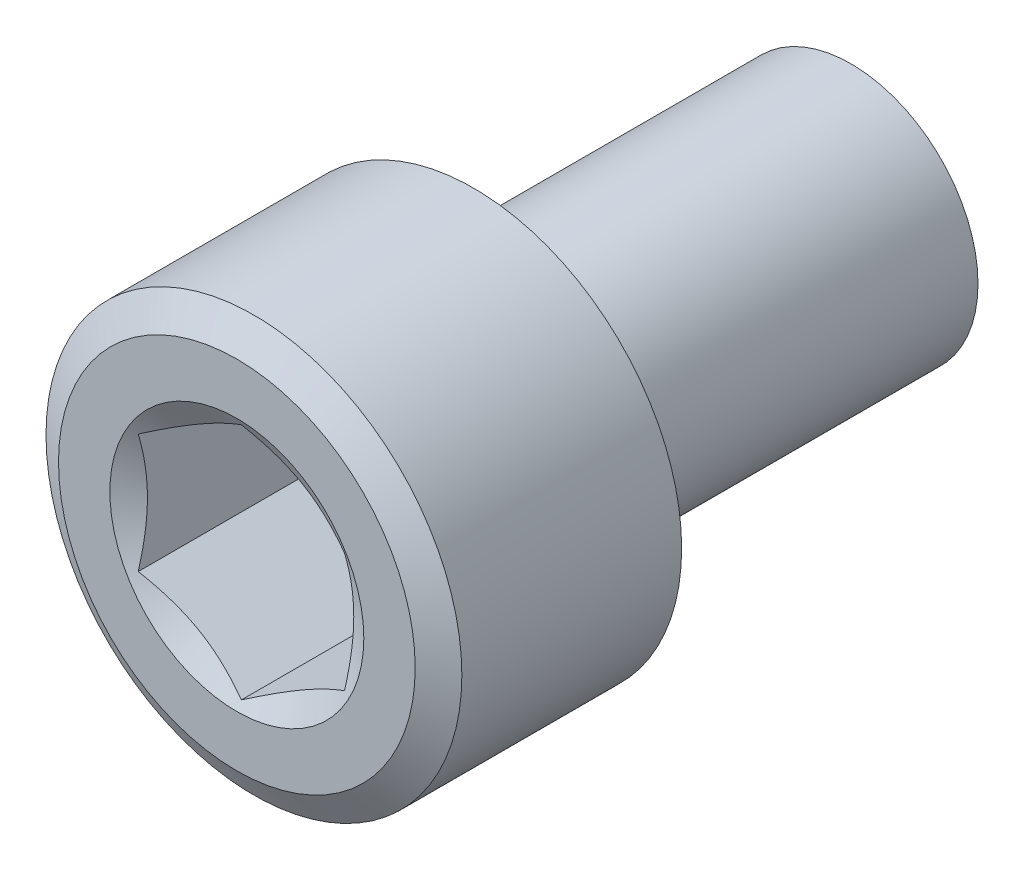
ISO-10303-21;
HEADER;
FILE_DESCRIPTION(('STEP AP214'),'2;1');
FILE_NAME('part.step','',(''),(''),'','','');
FILE_SCHEMA(('AUTOMOTIVE_DESIGN { 1 0 10303 214 1 1 1 1 }'));
ENDSEC;
DATA;
#1=APPLICATION_CONTEXT('core data for automotive mechanical design processes');
#2=APPLICATION_PROTOCOL_DEFINITION('international standard','automotive_design',2000,#1);
#3=PRODUCT_CONTEXT('',#1,'mechanical');
#4=PRODUCT('Part','Part','',(#3));
#5=PRODUCT_RELATED_PRODUCT_CATEGORY('part','',(#4));
#6=PRODUCT_DEFINITION_FORMATION('','',#4);
#7=PRODUCT_DEFINITION_CONTEXT('part definition',#1,'design');
#8=PRODUCT_DEFINITION('design','',#6,#7);
#9=PRODUCT_DEFINITION_SHAPE('','',#8);
#10=(LENGTH_UNIT() NAMED_UNIT(*) SI_UNIT(.MILLI.,.METRE.));
#11=(NAMED_UNIT(*) PLANE_ANGLE_UNIT() SI_UNIT($,.RADIAN.));
#12=(NAMED_UNIT(*) SI_UNIT($,.STERADIAN.) SOLID_ANGLE_UNIT());
#13=UNCERTAINTY_MEASURE_WITH_UNIT(LENGTH_MEASURE(1.E-05),#10,'distance_accuracy_value','');
#14=(GEOMETRIC_REPRESENTATION_CONTEXT(3) GLOBAL_UNCERTAINTY_ASSIGNED_CONTEXT((#13)) GLOBAL_UNIT_ASSIGNED_CONTEXT((#10,
#11,#12)) REPRESENTATION_CONTEXT('',''));
#15=CARTESIAN_POINT('',(0.,0.,0.));
#16=DIRECTION('',(0.,0.,1.));
#17=DIRECTION('',(1.,0.,0.));
#18=AXIS2_PLACEMENT_3D('',#15,#16,#17);
#19=CARTESIAN_POINT('',(0.,0.,0.));
#20=DIRECTION('',(0.,0.,-1.));
#21=DIRECTION('',(-1.,0.,0.));
#22=AXIS2_PLACEMENT_3D('',#19,#20,#21);
#23=PLANE('',#22);
#24=CARTESIAN_POINT('',(0.,0.,0.));
#25=DIRECTION('',(0.,0.,1.));
#26=DIRECTION('',(1.,0.,0.));
#27=AXIS2_PLACEMENT_3D('',#24,#25,#26);
#28=CIRCLE('',#27,4.);
#29=CARTESIAN_POINT('',(4.,0.,0.));
#30=VERTEX_POINT('',#29);
#31=EDGE_CURVE('E122',#30,#30,#28,.T.);
#32=ORIENTED_EDGE('',*,*,#31,.F.);
#33=EDGE_LOOP('',(#32));
#34=FACE_BOUND('',#33,.T.);
#35=CARTESIAN_POINT('',(0.,0.,0.));
#36=DIRECTION('',(0.,0.,1.));
#37=DIRECTION('',(1.,0.,0.));
#38=AXIS2_PLACEMENT_3D('',#35,#36,#37);
#39=CIRCLE('',#38,5.61815666552795);
#40=CARTESIAN_POINT('',(5.61815666552795,0.,0.));
#41=VERTEX_POINT('',#40);
#42=EDGE_CURVE('E47',#41,#41,#39,.T.);
#43=ORIENTED_EDGE('',*,*,#42,.T.);
#44=EDGE_LOOP('',(#43));
#45=FACE_BOUND('',#44,.T.);
#46=ADVANCED_FACE('F38',(#34,#45),#23,.F.);
#47=CARTESIAN_POINT('',(0.,0.,-0.538));
#48=DIRECTION('',(0.,0.,-1.));
#49=DIRECTION('',(-1.,0.,0.));
#50=AXIS2_PLACEMENT_3D('',#47,#48,#49);
#51=CONICAL_SURFACE('',#50,6.55,1.0471975511966);
#52=ORIENTED_EDGE('',*,*,#42,.F.);
#53=EDGE_LOOP('',(#52));
#54=FACE_BOUND('',#53,.T.);
#55=CARTESIAN_POINT('',(0.,0.,-0.538));
#56=DIRECTION('',(0.,0.,1.));
#57=DIRECTION('',(1.,0.,0.));
#58=AXIS2_PLACEMENT_3D('',#55,#56,#57);
#59=CIRCLE('',#58,6.55);
#60=CARTESIAN_POINT('',(6.55,0.,-0.538));
#61=VERTEX_POINT('',#60);
#62=EDGE_CURVE('E126',#61,#61,#59,.T.);
#63=ORIENTED_EDGE('',*,*,#62,.T.);
#64=EDGE_LOOP('',(#63));
#65=FACE_BOUND('',#64,.T.);
#66=ADVANCED_FACE('F112',(#54,#65),#51,.T.);
#67=CARTESIAN_POINT('',(0.,0.,0.));
#68=DIRECTION('',(0.,0.,1.));
#69=DIRECTION('',(1.,0.,0.));
#70=AXIS2_PLACEMENT_3D('',#67,#68,#69);
#71=CYLINDRICAL_SURFACE('',#70,6.55);
#72=ORIENTED_EDGE('',*,*,#62,.F.);
#73=EDGE_LOOP('',(#72));
#74=FACE_BOUND('',#73,.T.);
#75=CARTESIAN_POINT('',(0.,0.,-7.462));
#76=DIRECTION('',(0.,0.,1.));
#77=DIRECTION('',(1.,0.,0.));
#78=AXIS2_PLACEMENT_3D('',#75,#76,#77);
#79=CIRCLE('',#78,6.55);
#80=CARTESIAN_POINT('',(6.55,0.,-7.462));
#81=VERTEX_POINT('',#80);
#82=EDGE_CURVE('E130',#81,#81,#79,.T.);
#83=ORIENTED_EDGE('',*,*,#82,.T.);
#84=EDGE_LOOP('',(#83));
#85=FACE_BOUND('',#84,.T.);
#86=ADVANCED_FACE('F117',(#74,#85),#71,.T.);
#87=CARTESIAN_POINT('',(0.,0.,-8.));
#88=DIRECTION('',(0.,0.,1.));
#89=DIRECTION('',(1.,0.,0.));
#90=AXIS2_PLACEMENT_3D('',#87,#88,#89);
#91=CONICAL_SURFACE('',#90,5.61815666552795,1.0471975511966);
#92=ORIENTED_EDGE('',*,*,#82,.F.);
#93=EDGE_LOOP('',(#92));
#94=FACE_BOUND('',#93,.T.);
#95=CARTESIAN_POINT('',(0.,0.,-8.));
#96=DIRECTION('',(0.,0.,1.));
#97=DIRECTION('',(1.,0.,0.));
#98=AXIS2_PLACEMENT_3D('',#95,#96,#97);
#99=CIRCLE('',#98,5.61815666552795);
#100=CARTESIAN_POINT('',(5.61815666552795,0.,-8.));
#101=VERTEX_POINT('',#100);
#102=EDGE_CURVE('E240',#101,#101,#99,.T.);
#103=ORIENTED_EDGE('',*,*,#102,.T.);
#104=EDGE_LOOP('',(#103));
#105=FACE_BOUND('',#104,.T.);
#106=ADVANCED_FACE('F249',(#94,#105),#91,.T.);
#107=CARTESIAN_POINT('',(0.,5.61815666552795,-8.));
#108=DIRECTION('',(0.,0.,1.));
#109=DIRECTION('',(1.,0.,0.));
#110=AXIS2_PLACEMENT_3D('',#107,#108,#109);
#111=PLANE('',#110);
#112=ORIENTED_EDGE('',*,*,#102,.F.);
#113=EDGE_LOOP('',(#112));
#114=FACE_BOUND('',#113,.T.);
#115=CARTESIAN_POINT('',(0.,0.,-8.));
#116=DIRECTION('',(0.,0.,1.));
#117=DIRECTION('',(1.,0.,0.));
#118=AXIS2_PLACEMENT_3D('',#115,#116,#117);
#119=CIRCLE('',#118,4.);
#120=CARTESIAN_POINT('',(4.,0.,-8.));
#121=VERTEX_POINT('',#120);
#122=EDGE_CURVE('E236',#121,#121,#119,.T.);
#123=ORIENTED_EDGE('',*,*,#122,.T.);
#124=EDGE_LOOP('',(#123));
#125=FACE_BOUND('',#124,.T.);
#126=ADVANCED_FACE('F252',(#114,#125),#111,.F.);
#127=CARTESIAN_POINT('',(0.,0.,0.));
#128=DIRECTION('',(0.,0.,1.));
#129=DIRECTION('',(1.,0.,0.));
#130=AXIS2_PLACEMENT_3D('',#127,#128,#129);
#131=CYLINDRICAL_SURFACE('',#130,4.);
#132=CARTESIAN_POINT('',(0.,0.,-19.3475563354857));
#133=DIRECTION('',(0.,0.,1.));
#134=DIRECTION('',(1.,0.,0.));
#135=AXIS2_PLACEMENT_3D('',#132,#133,#134);
#136=CIRCLE('',#135,4.);
#137=CARTESIAN_POINT('',(4.,0.,-19.3475563354857));
#138=VERTEX_POINT('',#137);
#139=EDGE_CURVE('E41',#138,#138,#136,.T.);
#140=ORIENTED_EDGE('',*,*,#139,.T.);
#141=EDGE_LOOP('',(#140));
#142=FACE_BOUND('',#141,.T.);
#143=ORIENTED_EDGE('',*,*,#122,.F.);
#144=EDGE_LOOP('',(#143));
#145=FACE_BOUND('',#144,.T.);
#146=ADVANCED_FACE('F145',(#142,#145),#131,.T.);
#147=CARTESIAN_POINT('',(0.,0.,-2.30940107675847));
#148=DIRECTION('',(0.,0.,1.));
#149=DIRECTION('',(1.,0.,0.));
#150=AXIS2_PLACEMENT_3D('',#147,#148,#149);
#151=CONICAL_SURFACE('',#150,0.,1.0471975511966);
#152=ORIENTED_EDGE('',*,*,#31,.T.);
#153=EDGE_LOOP('',(#152));
#154=FACE_BOUND('',#153,.T.);
#155=CARTESIAN_POINT('',(3.25,-4.89660629492775,1.08369255627148));
#156=CARTESIAN_POINT('',(3.25,-4.75573833218522,1.01594975570711));
#157=CARTESIAN_POINT('',(3.25,-4.61453096698139,0.948899760360453));
#158=CARTESIAN_POINT('',(3.25,-4.3312562070658,0.816578471556628));
#159=CARTESIAN_POINT('',(3.25,-4.18918866622696,0.751307491306534));
#160=CARTESIAN_POINT('',(3.25,-3.90320931978041,0.622577708131281));
#161=CARTESIAN_POINT('',(3.25,-3.75929156621239,0.55913206988894));
#162=CARTESIAN_POINT('',(3.25,-3.4702590844915,0.435038922527749));
#163=CARTESIAN_POINT('',(3.25,-3.32514441815938,0.374391269946105));
#164=CARTESIAN_POINT('',(3.25,-3.02951456699183,0.255034292124203));
#165=CARTESIAN_POINT('',(3.25,-2.87895979613733,0.196422446361886));
#166=CARTESIAN_POINT('',(3.25,-2.57603706437933,0.0839927099501618));
#167=CARTESIAN_POINT('',(3.25,-2.42366889532025,0.0301753757864932));
#168=CARTESIAN_POINT('',(3.25,-2.11721147620763,-0.0711470948775624));
#169=CARTESIAN_POINT('',(3.25,-1.96312694192655,-0.118666342513277));
#170=CARTESIAN_POINT('',(3.25,-1.65275510414817,-0.205775052993387));
#171=CARTESIAN_POINT('',(3.25,-1.49646855625799,-0.245367168309317));
#172=CARTESIAN_POINT('',(3.25,-1.18238091695869,-0.314443575599651));
#173=CARTESIAN_POINT('',(3.25,-1.0245899609261,-0.343973067324086));
#174=CARTESIAN_POINT('',(3.25,-0.707207163555438,-0.391140063964166));
#175=CARTESIAN_POINT('',(3.25,-0.547615456370331,-0.408778448877575));
#176=CARTESIAN_POINT('',(3.25,-0.229445619508181,-0.430525519499229));
#177=CARTESIAN_POINT('',(3.25,-0.0708788640805303,-0.434796579763028));
#178=CARTESIAN_POINT('',(3.25,0.246055627179555,-0.429866218373045));
#179=CARTESIAN_POINT('',(3.25,0.404423350964302,-0.42066401709));
#180=CARTESIAN_POINT('',(3.25,0.677673438491507,-0.393787684326086));
#181=CARTESIAN_POINT('',(3.25,0.792857822716926,-0.37903765617208));
#182=CARTESIAN_POINT('',(3.25,1.02228182413567,-0.343410135455896));
#183=CARTESIAN_POINT('',(3.25,1.13652129099876,-0.322531686472633));
#184=CARTESIAN_POINT('',(3.25,1.4777218748365,-0.251812366920675));
#185=CARTESIAN_POINT('',(3.25,1.70302389459132,-0.19390315152715));
#186=CARTESIAN_POINT('',(3.25,2.03991920989564,-0.0947403883219288));
#187=CARTESIAN_POINT('',(3.25,2.1532840171806,-0.0591736318103052));
#188=CARTESIAN_POINT('',(3.25,2.37891078375274,0.015331941268612));
#189=CARTESIAN_POINT('',(3.25,2.49117273508905,0.0542707821265821));
#190=CARTESIAN_POINT('',(3.25,2.71463755498964,0.134922514415032));
#191=CARTESIAN_POINT('',(3.25,2.82584081681015,0.176634325866058));
#192=CARTESIAN_POINT('',(3.25,3.04734627101052,0.262373539705766));
#193=CARTESIAN_POINT('',(3.25,3.15764847906776,0.30640090170673));
#194=CARTESIAN_POINT('',(3.25,3.44225693000615,0.422900517805908));
#195=CARTESIAN_POINT('',(3.25,3.61596153730326,0.496840768471577));
#196=CARTESIAN_POINT('',(3.25,3.9617706188111,0.648384160787775));
#197=CARTESIAN_POINT('',(3.25,4.1338749640286,0.725987594706798));
#198=CARTESIAN_POINT('',(3.25,4.47683046628309,0.884020946334183));
#199=CARTESIAN_POINT('',(3.25,4.64768129333136,0.964451578158965));
#200=CARTESIAN_POINT('',(3.25,4.98833568172965,1.12750437614587));
#201=CARTESIAN_POINT('',(3.25,5.15813921849197,1.21012659352125));
#202=CARTESIAN_POINT('',(3.25,5.66669771876752,1.46076843846881));
#203=CARTESIAN_POINT('',(3.25,6.00418052132547,1.63136670466568));
#204=CARTESIAN_POINT('',(3.25,6.6768024773987,1.97696773868428));
#205=CARTESIAN_POINT('',(3.25,7.01194198122852,2.15196982934707));
#206=CARTESIAN_POINT('',(3.25,7.64835455593647,2.48799171546994));
#207=CARTESIAN_POINT('',(3.25,7.94977563042361,2.64873165029459));
#208=CARTESIAN_POINT('',(3.25,8.55164830810501,2.97204613549433));
#209=CARTESIAN_POINT('',(3.25,8.85209986676516,3.13462076864496));
#210=CARTESIAN_POINT('',(3.25,9.45145987511712,3.46070952063342));
#211=CARTESIAN_POINT('',(3.25,9.75037030405654,3.62422000561398));
#212=CARTESIAN_POINT('',(3.25,10.3475848815939,3.9523021172079));
#213=CARTESIAN_POINT('',(3.25,10.6458890658456,4.11687367889491));
#214=CARTESIAN_POINT('',(3.25,10.9439768537283,4.2818337436915));
#215=B_SPLINE_CURVE_WITH_KNOTS('',3,(#155,#156,#157,#158,#159,#160,#161,#162,#163,#164,#165,
#166,#167,#168,#169,#170,#171,#172,#173,#174,#175,#176,#177,#178,#179,#180,#181,#182,#183,#184,
#185,#186,#187,#188,#189,#190,#191,#192,#193,#194,#195,#196,#197,#198,#199,#200,#201,#202,#203,
#204,#205,#206,#207,#208,#209,#210,#211,#212,#213,#214),.UNSPECIFIED.,.F.,.F.,(4,2,2,2,2,2,2,2,
2,2,2,2,2,2,2,2,2,2,2,2,2,2,2,2,2,2,2,2,2,4),(0.,0.468937011905254,0.937956056781095,
1.40977870419016,1.88157713260634,2.36619833411049,2.85087571117736,3.33444809662955,
3.81785840411545,4.29906776592849,4.78024151207785,5.25554723347934,5.73088045949756,
6.07908380149246,6.42734151414057,7.12428147334441,7.48069507094447,7.8371112361694,
8.19338939334233,8.54966133838878,9.11596026782664,9.68230445626549,10.2487927392045,
10.8152942715988,11.9496883220206,13.0839089942731,14.1087066661115,15.1335507597631,
16.1556775715809,17.1777424229543),.UNSPECIFIED.);
#216=CARTESIAN_POINT('',(3.25,1.87638837486628,-0.142734410091835));
#217=VERTEX_POINT('',#216);
#218=CARTESIAN_POINT('',(3.25,-1.87638837486629,-0.142734410091835));
#219=VERTEX_POINT('',#218);
#220=EDGE_CURVE('E181',#217,#219,#215,.F.);
#221=ORIENTED_EDGE('',*,*,#220,.T.);
#222=CARTESIAN_POINT('',(3.2502,-1.87627290481245,-0.142667740348339));
#223=CARTESIAN_POINT('',(3.10737880748063,-1.95873075875949,-0.190292955189629));
#224=CARTESIAN_POINT('',(2.96332479190713,-2.0419003834287,-0.233606431856649));
#225=CARTESIAN_POINT('',(2.67272228671431,-2.20967981802895,-0.309210723922065));
#226=CARTESIAN_POINT('',(2.52616863329362,-2.29429260928211,-0.341474792986622));
#227=CARTESIAN_POINT('',(2.2348775937677,-2.46246956936492,-0.391698768714532));
#228=CARTESIAN_POINT('',(2.09018502771157,-2.54600786132717,-0.40999293821979));
#229=CARTESIAN_POINT('',(1.80011902775738,-2.71347754448347,-0.431832814317877));
#230=CARTESIAN_POINT('',(1.6547466482515,-2.79740832692393,-0.435396605746874));
#231=CARTESIAN_POINT('',(1.38310759119938,-2.95423920963539,-0.427984785522015));
#232=CARTESIAN_POINT('',(1.25680026129147,-3.02716278055835,-0.41882902776747));
#233=CARTESIAN_POINT('',(1.00500849737306,-3.17253482323637,-0.389809996939982));
#234=CARTESIAN_POINT('',(0.87952493433601,-3.24498279213469,-0.369936809818713));
#235=CARTESIAN_POINT('',(0.627213975272393,-3.39065459226956,-0.320255122527026));
#236=CARTESIAN_POINT('',(0.500418515106999,-3.46385998532807,-0.290236012042403));
#237=CARTESIAN_POINT('',(0.248718778280338,-3.6091788961399,-0.222104337430202));
#238=CARTESIAN_POINT('',(0.123811276681384,-3.68129427581186,-0.184007783111054));
#239=CARTESIAN_POINT('',(-0.000199999999996854,-3.75289221978641,-0.14266774034834));
#240=B_SPLINE_CURVE_WITH_KNOTS('',3,(#222,#223,#224,#225,#226,#227,#228,#229,#230,#231,#232,
#233,#234,#235,#236,#237,#238,#239),.UNSPECIFIED.,.F.,.F.,(4,2,2,2,2,2,2,2,4),(0.,
0.515166831490569,1.03157201112063,1.53519622021026,2.03820193386596,2.47618783582282,
2.91457958885821,3.3626959233107,3.80993224062138),.UNSPECIFIED.);
#241=CARTESIAN_POINT('',(0.,-3.75277674973257,-0.142734410091835));
#242=VERTEX_POINT('',#241);
#243=EDGE_CURVE('E174',#219,#242,#240,.T.);
#244=ORIENTED_EDGE('',*,*,#243,.T.);
#245=CARTESIAN_POINT('',(0.000200000000002927,-3.75289221978641,-0.14266774034834));
#246=CARTESIAN_POINT('',(-0.142621192519363,-3.67043436583937,-0.190292955189629));
#247=CARTESIAN_POINT('',(-0.286675208092867,-3.58726474117016,-0.233606431856649));
#248=CARTESIAN_POINT('',(-0.577277713285692,-3.4194853065699,-0.309210723922065));
#249=CARTESIAN_POINT('',(-0.723831366706376,-3.33487251531674,-0.341474792986623));
#250=CARTESIAN_POINT('',(-1.0151224062323,-3.16669555523393,-0.391698768714533));
#251=CARTESIAN_POINT('',(-1.15981497228842,-3.08315726327169,-0.409992938219791));
#252=CARTESIAN_POINT('',(-1.44988097224261,-2.91568758011538,-0.431832814317879));
#253=CARTESIAN_POINT('',(-1.5952533517485,-2.83175679767492,-0.435396605746875));
#254=CARTESIAN_POINT('',(-1.86689240880061,-2.67492591496346,-0.427984785522017));
#255=CARTESIAN_POINT('',(-1.99319973870853,-2.6020023440405,-0.418829027767473));
#256=CARTESIAN_POINT('',(-2.24499150262693,-2.45663030136248,-0.389809996939984));
#257=CARTESIAN_POINT('',(-2.37047506566399,-2.38418233246417,-0.369936809818714));
#258=CARTESIAN_POINT('',(-2.62278602472761,-2.23851053232929,-0.320255122527028));
#259=CARTESIAN_POINT('',(-2.749581484893,-2.16530513927078,-0.290236012042405));
#260=CARTESIAN_POINT('',(-3.00128122171966,-2.01998622845895,-0.222104337430204));
#261=CARTESIAN_POINT('',(-3.12618872331862,-1.94787084878699,-0.184007783111055));
#262=CARTESIAN_POINT('',(-3.2502,-1.87627290481244,-0.142667740348341));
#263=B_SPLINE_CURVE_WITH_KNOTS('',3,(#245,#246,#247,#248,#249,#250,#251,#252,#253,#254,#255,
#256,#257,#258,#259,#260,#261,#262),.UNSPECIFIED.,.F.,.F.,(4,2,2,2,2,2,2,2,4),(0.,
0.515166831490569,1.03157201112063,1.53519622021026,2.03820193386596,2.47618783582282,
2.91457958885821,3.3626959233107,3.80993224062138),.UNSPECIFIED.);
#264=CARTESIAN_POINT('',(-3.25,-1.87638837486628,-0.142734410091836));
#265=VERTEX_POINT('',#264);
#266=EDGE_CURVE('E167',#242,#265,#263,.T.);
#267=ORIENTED_EDGE('',*,*,#266,.T.);
#268=CARTESIAN_POINT('',(-3.25,-4.89660629492775,1.08369255627148));
#269=CARTESIAN_POINT('',(-3.25,-4.75573833218522,1.01594975570711));
#270=CARTESIAN_POINT('',(-3.25,-4.61453096698139,0.948899760360452));
#271=CARTESIAN_POINT('',(-3.25,-4.3312562070658,0.816578471556627));
#272=CARTESIAN_POINT('',(-3.25,-4.18918866622696,0.751307491306534));
#273=CARTESIAN_POINT('',(-3.25,-3.90320931978041,0.62257770813128));
#274=CARTESIAN_POINT('',(-3.25,-3.75929156621239,0.55913206988894));
#275=CARTESIAN_POINT('',(-3.25,-3.4702590844915,0.435038922527748));
#276=CARTESIAN_POINT('',(-3.25,-3.32514441815938,0.374391269946104));
#277=CARTESIAN_POINT('',(-3.25,-3.02951456699183,0.255034292124203));
#278=CARTESIAN_POINT('',(-3.25,-2.87895979613733,0.196422446361885));
#279=CARTESIAN_POINT('',(-3.25,-2.57603706437933,0.083992709950161));
#280=CARTESIAN_POINT('',(-3.25,-2.42366889532025,0.0301753757864927));
#281=CARTESIAN_POINT('',(-3.25,-2.11721147620763,-0.0711470948775628));
#282=CARTESIAN_POINT('',(-3.25,-1.96312694192655,-0.118666342513278));
#283=CARTESIAN_POINT('',(-3.25,-1.65275510414817,-0.205775052993388));
#284=CARTESIAN_POINT('',(-3.25,-1.49646855625798,-0.245367168309318));
#285=CARTESIAN_POINT('',(-3.25,-1.18238091695868,-0.314443575599651));
#286=CARTESIAN_POINT('',(-3.25,-1.0245899609261,-0.343973067324086));
#287=CARTESIAN_POINT('',(-3.25,-0.707207163555435,-0.391140063964167));
#288=CARTESIAN_POINT('',(-3.25,-0.547615456370328,-0.408778448877576));
#289=CARTESIAN_POINT('',(-3.25,-0.229445619508178,-0.430525519499229));
#290=CARTESIAN_POINT('',(-3.25,-0.0708788640805282,-0.434796579763028));
#291=CARTESIAN_POINT('',(-3.25,0.246055627179557,-0.429866218373045));
#292=CARTESIAN_POINT('',(-3.25,0.404423350964304,-0.42066401709));
#293=CARTESIAN_POINT('',(-3.25,0.67767343849151,-0.393787684326086));
#294=CARTESIAN_POINT('',(-3.25,0.792857822716929,-0.37903765617208));
#295=CARTESIAN_POINT('',(-3.25,1.02228182413567,-0.343410135455896));
#296=CARTESIAN_POINT('',(-3.25,1.13652129099876,-0.322531686472633));
#297=CARTESIAN_POINT('',(-3.25,1.4777218748365,-0.251812366920674));
#298=CARTESIAN_POINT('',(-3.25,1.70302389459132,-0.193903151527149));
#299=CARTESIAN_POINT('',(-3.25,2.03991920989564,-0.0947403883219281));
#300=CARTESIAN_POINT('',(-3.25,2.1532840171806,-0.0591736318103046));
#301=CARTESIAN_POINT('',(-3.25,2.37891078375274,0.0153319412686126));
#302=CARTESIAN_POINT('',(-3.25,2.49117273508905,0.0542707821265827));
#303=CARTESIAN_POINT('',(-3.25,2.71463755498964,0.134922514415033));
#304=CARTESIAN_POINT('',(-3.25,2.82584081681016,0.176634325866059));
#305=CARTESIAN_POINT('',(-3.25,3.04734627101052,0.262373539705767));
#306=CARTESIAN_POINT('',(-3.25,3.15764847906776,0.306400901706731));
#307=CARTESIAN_POINT('',(-3.25,3.44225693000616,0.42290051780591));
#308=CARTESIAN_POINT('',(-3.25,3.61596153730326,0.496840768471579));
#309=CARTESIAN_POINT('',(-3.25,3.96177061881111,0.648384160787777));
#310=CARTESIAN_POINT('',(-3.25,4.13387496402861,0.7259875947068));
#311=CARTESIAN_POINT('',(-3.25,4.47683046628309,0.884020946334186));
#312=CARTESIAN_POINT('',(-3.25,4.64768129333137,0.964451578158968));
#313=CARTESIAN_POINT('',(-3.25,4.98833568172966,1.12750437614587));
#314=CARTESIAN_POINT('',(-3.25,5.15813921849197,1.21012659352125));
#315=CARTESIAN_POINT('',(-3.25,5.66669771876753,1.46076843846881));
#316=CARTESIAN_POINT('',(-3.25,6.00418052132548,1.63136670466568));
#317=CARTESIAN_POINT('',(-3.25,6.67680247739871,1.97696773868428));
#318=CARTESIAN_POINT('',(-3.25,7.01194198122852,2.15196982934708));
#319=CARTESIAN_POINT('',(-3.25,7.64835455593648,2.48799171546994));
#320=CARTESIAN_POINT('',(-3.25,7.94977563042362,2.64873165029459));
#321=CARTESIAN_POINT('',(-3.25,8.55164830810502,2.97204613549434));
#322=CARTESIAN_POINT('',(-3.25,8.85209986676516,3.13462076864496));
#323=CARTESIAN_POINT('',(-3.25,9.45145987511712,3.46070952063342));
#324=CARTESIAN_POINT('',(-3.25,9.75037030405654,3.62422000561399));
#325=CARTESIAN_POINT('',(-3.25,10.3475848815939,3.9523021172079));
#326=CARTESIAN_POINT('',(-3.25,10.6458890658456,4.11687367889492));
#327=CARTESIAN_POINT('',(-3.25,10.9439768537283,4.2818337436915));
#328=B_SPLINE_CURVE_WITH_KNOTS('',3,(#268,#269,#270,#271,#272,#273,#274,#275,#276,#277,#278,
#279,#280,#281,#282,#283,#284,#285,#286,#287,#288,#289,#290,#291,#292,#293,#294,#295,#296,#297,
#298,#299,#300,#301,#302,#303,#304,#305,#306,#307,#308,#309,#310,#311,#312,#313,#314,#315,#316,
#317,#318,#319,#320,#321,#322,#323,#324,#325,#326,#327),.UNSPECIFIED.,.F.,.F.,(4,2,2,2,2,2,2,2,
2,2,2,2,2,2,2,2,2,2,2,2,2,2,2,2,2,2,2,2,2,4),(0.,0.468937011905254,0.937956056781095,
1.40977870419016,1.88157713260634,2.36619833411049,2.85087571117736,3.33444809662955,
3.81785840411545,4.29906776592849,4.78024151207785,5.25554723347934,5.73088045949756,
6.07908380149246,6.42734151414057,7.12428147334441,7.48069507094447,7.83711123616941,
8.19338939334233,8.54966133838879,9.11596026782665,9.6823044562655,10.2487927392046,
10.8152942715988,11.9496883220206,13.0839089942731,14.1087066661116,15.1335507597631,
16.1556775715809,17.1777424229543),.UNSPECIFIED.);
#329=CARTESIAN_POINT('',(-3.25,1.87638837486628,-0.142734410091835));
#330=VERTEX_POINT('',#329);
#331=EDGE_CURVE('E160',#265,#330,#328,.T.);
#332=ORIENTED_EDGE('',*,*,#331,.T.);
#333=CARTESIAN_POINT('',(-3.2502,1.87627290481245,-0.14266774034834));
#334=CARTESIAN_POINT('',(-3.10737880748063,1.95873075875949,-0.190292955189629));
#335=CARTESIAN_POINT('',(-2.96332479190713,2.04190038342869,-0.233606431856649));
#336=CARTESIAN_POINT('',(-2.6727222867143,2.20967981802895,-0.309210723922065));
#337=CARTESIAN_POINT('',(-2.52616863329362,2.29429260928211,-0.341474792986623));
#338=CARTESIAN_POINT('',(-2.2348775937677,2.46246956936492,-0.391698768714532));
#339=CARTESIAN_POINT('',(-2.09018502771157,2.54600786132717,-0.409992938219791));
#340=CARTESIAN_POINT('',(-1.80011902775738,2.71347754448347,-0.431832814317878));
#341=CARTESIAN_POINT('',(-1.6547466482515,2.79740832692393,-0.435396605746875));
#342=CARTESIAN_POINT('',(-1.38310759119938,2.95423920963539,-0.427984785522016));
#343=CARTESIAN_POINT('',(-1.25680026129147,3.02716278055835,-0.418829027767471));
#344=CARTESIAN_POINT('',(-1.00500849737306,3.17253482323637,-0.389809996939983));
#345=CARTESIAN_POINT('',(-0.879524934336009,3.24498279213468,-0.369936809818713));
#346=CARTESIAN_POINT('',(-0.627213975272391,3.39065459226956,-0.320255122527026));
#347=CARTESIAN_POINT('',(-0.500418515106997,3.46385998532807,-0.290236012042404));
#348=CARTESIAN_POINT('',(-0.248718778280335,3.6091788961399,-0.222104337430202));
#349=CARTESIAN_POINT('',(-0.12381127668138,3.68129427581186,-0.184007783111054));
#350=CARTESIAN_POINT('',(0.000200000000000409,3.75289221978641,-0.14266774034834));
#351=B_SPLINE_CURVE_WITH_KNOTS('',3,(#333,#334,#335,#336,#337,#338,#339,#340,#341,#342,#343,
#344,#345,#346,#347,#348,#349,#350),.UNSPECIFIED.,.F.,.F.,(4,2,2,2,2,2,2,2,4),(0.,
0.51516683149057,1.03157201112063,1.53519622021026,2.03820193386596,2.47618783582282,
2.91457958885821,3.3626959233107,3.80993224062138),.UNSPECIFIED.);
#352=CARTESIAN_POINT('',(0.,3.75277674973257,-0.142734410091835));
#353=VERTEX_POINT('',#352);
#354=EDGE_CURVE('E53',#330,#353,#351,.T.);
#355=ORIENTED_EDGE('',*,*,#354,.T.);
#356=CARTESIAN_POINT('',(-0.000199999999999762,3.7528922197864,-0.14266774034834));
#357=CARTESIAN_POINT('',(0.142621192519366,3.67043436583937,-0.190292955189629));
#358=CARTESIAN_POINT('',(0.28667520809287,3.58726474117016,-0.233606431856649));
#359=CARTESIAN_POINT('',(0.577277713285695,3.4194853065699,-0.309210723922065));
#360=CARTESIAN_POINT('',(0.72383136670638,3.33487251531674,-0.341474792986622));
#361=CARTESIAN_POINT('',(1.0151224062323,3.16669555523393,-0.391698768714532));
#362=CARTESIAN_POINT('',(1.15981497228843,3.08315726327169,-0.409992938219791));
#363=CARTESIAN_POINT('',(1.44988097224262,2.91568758011538,-0.431832814317878));
#364=CARTESIAN_POINT('',(1.5952533517485,2.83175679767492,-0.435396605746875));
#365=CARTESIAN_POINT('',(1.86689240880062,2.67492591496346,-0.427984785522016));
#366=CARTESIAN_POINT('',(1.99319973870853,2.60200234404051,-0.418829027767471));
#367=CARTESIAN_POINT('',(2.24499150262694,2.45663030136248,-0.389809996939983));
#368=CARTESIAN_POINT('',(2.37047506566399,2.38418233246417,-0.369936809818713));
#369=CARTESIAN_POINT('',(2.62278602472761,2.23851053232929,-0.320255122527027));
#370=CARTESIAN_POINT('',(2.749581484893,2.16530513927078,-0.290236012042404));
#371=CARTESIAN_POINT('',(3.00128122171966,2.01998622845895,-0.222104337430202));
#372=CARTESIAN_POINT('',(3.12618872331862,1.94787084878699,-0.184007783111053));
#373=CARTESIAN_POINT('',(3.2502,1.87627290481245,-0.142667740348339));
#374=B_SPLINE_CURVE_WITH_KNOTS('',3,(#356,#357,#358,#359,#360,#361,#362,#363,#364,#365,#366,
#367,#368,#369,#370,#371,#372,#373),.UNSPECIFIED.,.F.,.F.,(4,2,2,2,2,2,2,2,4),(0.,
0.515166831490569,1.03157201112063,1.53519622021026,2.03820193386596,2.47618783582282,
2.91457958885821,3.3626959233107,3.80993224062138),.UNSPECIFIED.);
#375=EDGE_CURVE('E11',#353,#217,#374,.T.);
#376=ORIENTED_EDGE('',*,*,#375,.T.);
#377=EDGE_LOOP('',(#221,#244,#267,#332,#355,#376));
#378=FACE_BOUND('',#377,.T.);
#379=ADVANCED_FACE('F142',(#154,#378),#151,.F.);
#380=CARTESIAN_POINT('',(3.25,1.87638837486628,-6.));
#381=DIRECTION('',(0.5,0.866025403784439,0.));
#382=DIRECTION('',(-0.866025403784439,0.5,0.));
#383=AXIS2_PLACEMENT_3D('',#380,#381,#382);
#384=PLANE('',#383);
#385=ORIENTED_EDGE('',*,*,#375,.F.);
#386=DIRECTION('',(0.,0.,1.));
#387=VECTOR('',#386,1.);
#388=CARTESIAN_POINT('',(0.,3.75277674973257,-6.));
#389=LINE('',#388,#387);
#390=CARTESIAN_POINT('',(0.,3.75277674973257,-6.));
#391=VERTEX_POINT('',#390);
#392=EDGE_CURVE('E215',#391,#353,#389,.T.);
#393=ORIENTED_EDGE('',*,*,#392,.F.);
#394=DIRECTION('',(-0.866025403784439,0.5,0.));
#395=VECTOR('',#394,1.);
#396=CARTESIAN_POINT('',(3.25,1.87638837486628,-6.));
#397=LINE('',#396,#395);
#398=CARTESIAN_POINT('',(3.25,1.87638837486629,-6.));
#399=VERTEX_POINT('',#398);
#400=EDGE_CURVE('E416',#399,#391,#397,.T.);
#401=ORIENTED_EDGE('',*,*,#400,.F.);
#402=DIRECTION('',(0.,0.,1.));
#403=VECTOR('',#402,1.);
#404=CARTESIAN_POINT('',(3.25,1.87638837486628,-6.));
#405=LINE('',#404,#403);
#406=EDGE_CURVE('E228',#399,#217,#405,.T.);
#407=ORIENTED_EDGE('',*,*,#406,.T.);
#408=EDGE_LOOP('',(#385,#393,#401,#407));
#409=FACE_BOUND('',#408,.T.);
#410=ADVANCED_FACE('F138',(#409),#384,.F.);
#411=CARTESIAN_POINT('',(0.,3.75277674973257,-6.));
#412=DIRECTION('',(-0.5,0.866025403784439,0.));
#413=DIRECTION('',(-0.866025403784439,-0.5,0.));
#414=AXIS2_PLACEMENT_3D('',#411,#412,#413);
#415=PLANE('',#414);
#416=ORIENTED_EDGE('',*,*,#354,.F.);
#417=DIRECTION('',(0.,0.,1.));
#418=VECTOR('',#417,1.);
#419=CARTESIAN_POINT('',(-3.25,1.87638837486628,-6.));
#420=LINE('',#419,#418);
#421=CARTESIAN_POINT('',(-3.25,1.87638837486628,-6.));
#422=VERTEX_POINT('',#421);
#423=EDGE_CURVE('E212',#422,#330,#420,.T.);
#424=ORIENTED_EDGE('',*,*,#423,.F.);
#425=DIRECTION('',(-0.866025403784439,-0.5,0.));
#426=VECTOR('',#425,1.);
#427=CARTESIAN_POINT('',(0.,3.75277674973257,-6.));
#428=LINE('',#427,#426);
#429=EDGE_CURVE('E419',#391,#422,#428,.T.);
#430=ORIENTED_EDGE('',*,*,#429,.F.);
#431=ORIENTED_EDGE('',*,*,#392,.T.);
#432=EDGE_LOOP('',(#416,#424,#430,#431));
#433=FACE_BOUND('',#432,.T.);
#434=ADVANCED_FACE('F199',(#433),#415,.F.);
#435=CARTESIAN_POINT('',(-3.25,1.87638837486628,-6.));
#436=DIRECTION('',(-1.,0.,0.));
#437=DIRECTION('',(0.,-1.,0.));
#438=AXIS2_PLACEMENT_3D('',#435,#436,#437);
#439=PLANE('',#438);
#440=ORIENTED_EDGE('',*,*,#331,.F.);
#441=DIRECTION('',(0.,0.,1.));
#442=VECTOR('',#441,1.);
#443=CARTESIAN_POINT('',(-3.25,-1.87638837486628,-6.));
#444=LINE('',#443,#442);
#445=CARTESIAN_POINT('',(-3.25,-1.87638837486628,-6.));
#446=VERTEX_POINT('',#445);
#447=EDGE_CURVE('E222',#446,#265,#444,.T.);
#448=ORIENTED_EDGE('',*,*,#447,.F.);
#449=DIRECTION('',(0.,-1.,0.));
#450=VECTOR('',#449,1.);
#451=CARTESIAN_POINT('',(-3.25,1.87638837486628,-6.));
#452=LINE('',#451,#450);
#453=EDGE_CURVE('E220',#422,#446,#452,.T.);
#454=ORIENTED_EDGE('',*,*,#453,.F.);
#455=ORIENTED_EDGE('',*,*,#423,.T.);
#456=EDGE_LOOP('',(#440,#448,#454,#455));
#457=FACE_BOUND('',#456,.T.);
#458=ADVANCED_FACE('F195',(#457),#439,.F.);
#459=CARTESIAN_POINT('',(-3.25,-1.87638837486628,-6.));
#460=DIRECTION('',(-0.5,-0.866025403784439,0.));
#461=DIRECTION('',(0.866025403784439,-0.5,0.));
#462=AXIS2_PLACEMENT_3D('',#459,#460,#461);
#463=PLANE('',#462);
#464=ORIENTED_EDGE('',*,*,#266,.F.);
#465=DIRECTION('',(0.,0.,1.));
#466=VECTOR('',#465,1.);
#467=CARTESIAN_POINT('',(0.,-3.75277674973257,-6.));
#468=LINE('',#467,#466);
#469=CARTESIAN_POINT('',(0.,-3.75277674973257,-6.));
#470=VERTEX_POINT('',#469);
#471=EDGE_CURVE('E226',#470,#242,#468,.T.);
#472=ORIENTED_EDGE('',*,*,#471,.F.);
#473=DIRECTION('',(0.866025403784439,-0.5,0.));
#474=VECTOR('',#473,1.);
#475=CARTESIAN_POINT('',(-3.25,-1.87638837486628,-6.));
#476=LINE('',#475,#474);
#477=EDGE_CURVE('E392',#446,#470,#476,.T.);
#478=ORIENTED_EDGE('',*,*,#477,.F.);
#479=ORIENTED_EDGE('',*,*,#447,.T.);
#480=EDGE_LOOP('',(#464,#472,#478,#479));
#481=FACE_BOUND('',#480,.T.);
#482=ADVANCED_FACE('F191',(#481),#463,.F.);
#483=CARTESIAN_POINT('',(0.,-3.75277674973257,-6.));
#484=DIRECTION('',(0.5,-0.866025403784439,0.));
#485=DIRECTION('',(0.866025403784439,0.5,0.));
#486=AXIS2_PLACEMENT_3D('',#483,#484,#485);
#487=PLANE('',#486);
#488=ORIENTED_EDGE('',*,*,#243,.F.);
#489=DIRECTION('',(0.,0.,1.));
#490=VECTOR('',#489,1.);
#491=CARTESIAN_POINT('',(3.25,-1.87638837486629,-6.));
#492=LINE('',#491,#490);
#493=CARTESIAN_POINT('',(3.25,-1.87638837486629,-6.));
#494=VERTEX_POINT('',#493);
#495=EDGE_CURVE('E241',#494,#219,#492,.T.);
#496=ORIENTED_EDGE('',*,*,#495,.F.);
#497=DIRECTION('',(0.866025403784438,0.5,0.));
#498=VECTOR('',#497,1.);
#499=CARTESIAN_POINT('',(0.,-3.75277674973257,-6.));
#500=LINE('',#499,#498);
#501=EDGE_CURVE('E235',#470,#494,#500,.T.);
#502=ORIENTED_EDGE('',*,*,#501,.F.);
#503=ORIENTED_EDGE('',*,*,#471,.T.);
#504=EDGE_LOOP('',(#488,#496,#502,#503));
#505=FACE_BOUND('',#504,.T.);
#506=ADVANCED_FACE('F187',(#505),#487,.F.);
#507=CARTESIAN_POINT('',(3.25,-1.87638837486629,-6.));
#508=DIRECTION('',(1.,0.,0.));
#509=DIRECTION('',(0.,1.,0.));
#510=AXIS2_PLACEMENT_3D('',#507,#508,#509);
#511=PLANE('',#510);
#512=ORIENTED_EDGE('',*,*,#220,.F.);
#513=ORIENTED_EDGE('',*,*,#406,.F.);
#514=DIRECTION('',(0.,1.,0.));
#515=VECTOR('',#514,1.);
#516=CARTESIAN_POINT('',(3.25,-1.87638837486629,-6.));
#517=LINE('',#516,#515);
#518=EDGE_CURVE('E412',#494,#399,#517,.T.);
#519=ORIENTED_EDGE('',*,*,#518,.F.);
#520=ORIENTED_EDGE('',*,*,#495,.T.);
#521=EDGE_LOOP('',(#512,#513,#519,#520));
#522=FACE_BOUND('',#521,.T.);
#523=ADVANCED_FACE('F190',(#522),#511,.F.);
#524=CARTESIAN_POINT('',(0.,0.,-6.));
#525=DIRECTION('',(0.,0.,-1.));
#526=DIRECTION('',(-1.,0.,0.));
#527=AXIS2_PLACEMENT_3D('',#524,#525,#526);
#528=PLANE('',#527);
#529=ORIENTED_EDGE('',*,*,#518,.T.);
#530=CARTESIAN_POINT('',(0.,0.,-6.));
#531=DIRECTION('',(0.,0.,1.));
#532=DIRECTION('',(1.,0.,0.));
#533=AXIS2_PLACEMENT_3D('',#530,#531,#532);
#534=CIRCLE('',#533,3.75277674973257);
#535=EDGE_CURVE('E434',#494,#399,#534,.T.);
#536=ORIENTED_EDGE('',*,*,#535,.F.);
#537=EDGE_LOOP('',(#529,#536));
#538=FACE_BOUND('',#537,.T.);
#539=ADVANCED_FACE('F108',(#538),#528,.T.);
#540=ORIENTED_EDGE('',*,*,#400,.T.);
#541=EDGE_CURVE('E431',#399,#391,#534,.T.);
#542=ORIENTED_EDGE('',*,*,#541,.F.);
#543=EDGE_LOOP('',(#540,#542));
#544=FACE_BOUND('',#543,.T.);
#545=ADVANCED_FACE('F337',(#544),#528,.T.);
#546=ORIENTED_EDGE('',*,*,#429,.T.);
#547=EDGE_CURVE('E428',#391,#422,#534,.T.);
#548=ORIENTED_EDGE('',*,*,#547,.F.);
#549=EDGE_LOOP('',(#546,#548));
#550=FACE_BOUND('',#549,.T.);
#551=ADVANCED_FACE('F346',(#550),#528,.T.);
#552=ORIENTED_EDGE('',*,*,#453,.T.);
#553=EDGE_CURVE('E425',#422,#446,#534,.T.);
#554=ORIENTED_EDGE('',*,*,#553,.F.);
#555=EDGE_LOOP('',(#552,#554));
#556=FACE_BOUND('',#555,.T.);
#557=ADVANCED_FACE('F355',(#556),#528,.T.);
#558=ORIENTED_EDGE('',*,*,#477,.T.);
#559=EDGE_CURVE('E61',#446,#470,#534,.T.);
#560=ORIENTED_EDGE('',*,*,#559,.F.);
#561=EDGE_LOOP('',(#558,#560));
#562=FACE_BOUND('',#561,.T.);
#563=ADVANCED_FACE('F105',(#562),#528,.T.);
#564=ORIENTED_EDGE('',*,*,#501,.T.);
#565=EDGE_CURVE('E440',#470,#494,#534,.T.);
#566=ORIENTED_EDGE('',*,*,#565,.F.);
#567=EDGE_LOOP('',(#564,#566));
#568=FACE_BOUND('',#567,.T.);
#569=ADVANCED_FACE('F97',(#568),#528,.T.);
#570=CARTESIAN_POINT('',(0.,0.,-8.16666666666664));
#571=DIRECTION('',(0.,0.,1.));
#572=DIRECTION('',(1.,0.,0.));
#573=AXIS2_PLACEMENT_3D('',#570,#571,#572);
#574=CONICAL_SURFACE('',#573,0.,1.0471975511966);
#575=ORIENTED_EDGE('',*,*,#541,.T.);
#576=ORIENTED_EDGE('',*,*,#547,.T.);
#577=ORIENTED_EDGE('',*,*,#553,.T.);
#578=ORIENTED_EDGE('',*,*,#559,.T.);
#579=ORIENTED_EDGE('',*,*,#565,.T.);
#580=ORIENTED_EDGE('',*,*,#535,.T.);
#581=EDGE_LOOP('',(#575,#576,#577,#578,#579,#580));
#582=FACE_BOUND('',#581,.T.);
#583=CARTESIAN_POINT('',(0.,0.,-8.16666666666664));
#584=VERTEX_POINT('',#583);
#585=VERTEX_LOOP('',#584);
#586=FACE_BOUND('',#585,.T.);
#587=ADVANCED_FACE('F94',(#582,#586),#574,.F.);
#588=CARTESIAN_POINT('',(-60.,5.35285470491093,-19.3475563354857));
#589=DIRECTION('',(0.,0.,1.));
#590=DIRECTION('',(1.,0.,0.));
#591=AXIS2_PLACEMENT_3D('',#588,#589,#590);
#592=PLANE('',#591);
#593=ORIENTED_EDGE('',*,*,#139,.F.);
#594=EDGE_LOOP('',(#593));
#595=FACE_BOUND('',#594,.T.);
#596=ADVANCED_FACE('F96',(#595),#592,.F.);
#597=CLOSED_SHELL('',(#46,#66,#86,#106,#126,#146,#379,#410,#434,#458,#482,#506,#523,#539,#545,
#551,#557,#563,#569,#587,#596));
#598=MANIFOLD_SOLID_BREP('B2',#597);
#599=ADVANCED_BREP_SHAPE_REPRESENTATION('',(#18,#598),#14);
#600=SHAPE_DEFINITION_REPRESENTATION(#9,#599);
ENDSEC;
END-ISO-10303-21;
